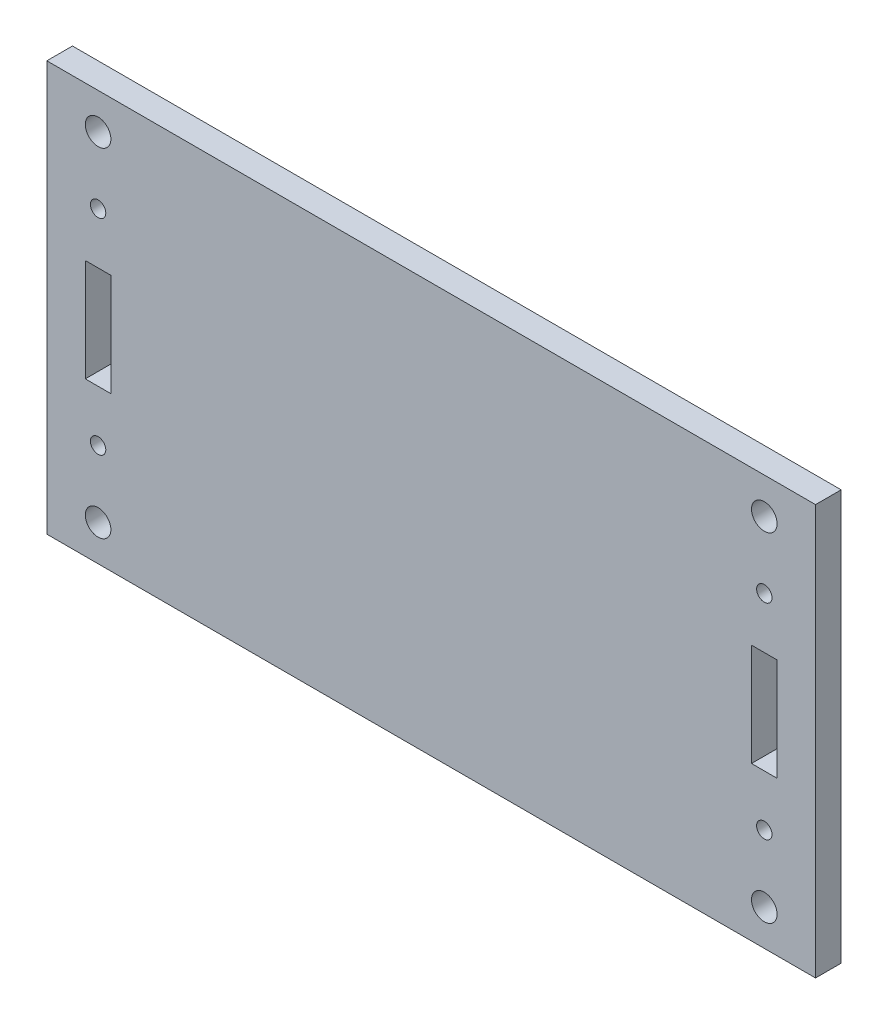
ISO-10303-21;
HEADER;
FILE_DESCRIPTION(('STEP AP214'),'2;1');
FILE_NAME('part.step','',(''),(''),'','','');
FILE_SCHEMA(('AUTOMOTIVE_DESIGN { 1 0 10303 214 1 1 1 1 }'));
ENDSEC;
DATA;
#1=APPLICATION_CONTEXT('core data for automotive mechanical design processes');
#2=APPLICATION_PROTOCOL_DEFINITION('international standard','automotive_design',2000,#1);
#3=PRODUCT_CONTEXT('',#1,'mechanical');
#4=PRODUCT('Part','Part','',(#3));
#5=PRODUCT_RELATED_PRODUCT_CATEGORY('part','',(#4));
#6=PRODUCT_DEFINITION_FORMATION('','',#4);
#7=PRODUCT_DEFINITION_CONTEXT('part definition',#1,'design');
#8=PRODUCT_DEFINITION('design','',#6,#7);
#9=PRODUCT_DEFINITION_SHAPE('','',#8);
#10=(LENGTH_UNIT() NAMED_UNIT(*) SI_UNIT(.MILLI.,.METRE.));
#11=(NAMED_UNIT(*) PLANE_ANGLE_UNIT() SI_UNIT($,.RADIAN.));
#12=(NAMED_UNIT(*) SI_UNIT($,.STERADIAN.) SOLID_ANGLE_UNIT());
#13=UNCERTAINTY_MEASURE_WITH_UNIT(LENGTH_MEASURE(1.E-05),#10,'distance_accuracy_value','');
#14=(GEOMETRIC_REPRESENTATION_CONTEXT(3) GLOBAL_UNCERTAINTY_ASSIGNED_CONTEXT((#13)) GLOBAL_UNIT_ASSIGNED_CONTEXT((#10,
#11,#12)) REPRESENTATION_CONTEXT('',''));
#15=CARTESIAN_POINT('',(0.,0.,0.));
#16=DIRECTION('',(0.,0.,1.));
#17=DIRECTION('',(1.,0.,0.));
#18=AXIS2_PLACEMENT_3D('',#15,#16,#17);
#19=CARTESIAN_POINT('',(0.,0.,5.));
#20=DIRECTION('',(0.,0.,1.));
#21=DIRECTION('',(1.,0.,0.));
#22=AXIS2_PLACEMENT_3D('',#19,#20,#21);
#23=PLANE('',#22);
#24=DIRECTION('',(-1.,0.,0.));
#25=VECTOR('',#24,1.);
#26=CARTESIAN_POINT('',(67.5,20.,5.));
#27=LINE('',#26,#25);
#28=CARTESIAN_POINT('',(67.5,20.,5.));
#29=VERTEX_POINT('',#28);
#30=CARTESIAN_POINT('',(62.5,20.,5.));
#31=VERTEX_POINT('',#30);
#32=EDGE_CURVE('E136',#29,#31,#27,.T.);
#33=ORIENTED_EDGE('',*,*,#32,.F.);
#34=DIRECTION('',(0.,1.,0.));
#35=VECTOR('',#34,1.);
#36=CARTESIAN_POINT('',(67.5,20.,5.));
#37=LINE('',#36,#35);
#38=CARTESIAN_POINT('',(67.5,0.,5.));
#39=VERTEX_POINT('',#38);
#40=EDGE_CURVE('E128',#39,#29,#37,.T.);
#41=ORIENTED_EDGE('',*,*,#40,.F.);
#42=DIRECTION('',(1.,0.,0.));
#43=VECTOR('',#42,1.);
#44=CARTESIAN_POINT('',(67.5,0.,5.));
#45=LINE('',#44,#43);
#46=CARTESIAN_POINT('',(62.5,0.,5.));
#47=VERTEX_POINT('',#46);
#48=EDGE_CURVE('E151',#47,#39,#45,.T.);
#49=ORIENTED_EDGE('',*,*,#48,.F.);
#50=DIRECTION('',(0.,-1.,0.));
#51=VECTOR('',#50,1.);
#52=CARTESIAN_POINT('',(62.5,20.,5.));
#53=LINE('',#52,#51);
#54=EDGE_CURVE('E149',#31,#47,#53,.T.);
#55=ORIENTED_EDGE('',*,*,#54,.F.);
#56=EDGE_LOOP('',(#33,#41,#49,#55));
#57=FACE_BOUND('',#56,.T.);
#58=CARTESIAN_POINT('',(65.,30.,5.));
#59=DIRECTION('',(0.,0.,1.));
#60=DIRECTION('',(-1.,0.,0.));
#61=AXIS2_PLACEMENT_3D('',#58,#59,#60);
#62=CIRCLE('',#61,1.5);
#63=CARTESIAN_POINT('',(63.5,30.,5.));
#64=VERTEX_POINT('',#63);
#65=EDGE_CURVE('E167',#64,#64,#62,.T.);
#66=ORIENTED_EDGE('',*,*,#65,.F.);
#67=EDGE_LOOP('',(#66));
#68=FACE_BOUND('',#67,.T.);
#69=CARTESIAN_POINT('',(-65.,-9.99999999999999,5.));
#70=DIRECTION('',(0.,0.,1.));
#71=DIRECTION('',(-1.,0.,0.));
#72=AXIS2_PLACEMENT_3D('',#69,#70,#71);
#73=CIRCLE('',#72,1.5);
#74=CARTESIAN_POINT('',(-66.5,-9.99999999999999,5.));
#75=VERTEX_POINT('',#74);
#76=EDGE_CURVE('E179',#75,#75,#73,.T.);
#77=ORIENTED_EDGE('',*,*,#76,.F.);
#78=EDGE_LOOP('',(#77));
#79=FACE_BOUND('',#78,.T.);
#80=CARTESIAN_POINT('',(65.,-23.,5.));
#81=DIRECTION('',(0.,0.,1.));
#82=DIRECTION('',(1.,0.,0.));
#83=AXIS2_PLACEMENT_3D('',#80,#81,#82);
#84=CIRCLE('',#83,2.5);
#85=CARTESIAN_POINT('',(67.5,-23.,5.));
#86=VERTEX_POINT('',#85);
#87=EDGE_CURVE('E222',#86,#86,#84,.T.);
#88=ORIENTED_EDGE('',*,*,#87,.F.);
#89=EDGE_LOOP('',(#88));
#90=FACE_BOUND('',#89,.T.);
#91=CARTESIAN_POINT('',(-65.,43.,5.));
#92=DIRECTION('',(0.,0.,1.));
#93=DIRECTION('',(1.,0.,0.));
#94=AXIS2_PLACEMENT_3D('',#91,#92,#93);
#95=CIRCLE('',#94,2.50000000000001);
#96=CARTESIAN_POINT('',(-62.5,43.,5.));
#97=VERTEX_POINT('',#96);
#98=EDGE_CURVE('E234',#97,#97,#95,.T.);
#99=ORIENTED_EDGE('',*,*,#98,.F.);
#100=EDGE_LOOP('',(#99));
#101=FACE_BOUND('',#100,.T.);
#102=DIRECTION('',(0.,1.,0.));
#103=VECTOR('',#102,1.);
#104=CARTESIAN_POINT('',(75.,50.,5.));
#105=LINE('',#104,#103);
#106=CARTESIAN_POINT('',(75.,-30.,5.));
#107=VERTEX_POINT('',#106);
#108=CARTESIAN_POINT('',(75.,50.,5.));
#109=VERTEX_POINT('',#108);
#110=EDGE_CURVE('E240',#107,#109,#105,.T.);
#111=ORIENTED_EDGE('',*,*,#110,.T.);
#112=DIRECTION('',(-1.,0.,0.));
#113=VECTOR('',#112,1.);
#114=CARTESIAN_POINT('',(-75.,50.,5.));
#115=LINE('',#114,#113);
#116=CARTESIAN_POINT('',(-75.,50.,5.));
#117=VERTEX_POINT('',#116);
#118=EDGE_CURVE('E243',#109,#117,#115,.T.);
#119=ORIENTED_EDGE('',*,*,#118,.T.);
#120=DIRECTION('',(0.,-1.,0.));
#121=VECTOR('',#120,1.);
#122=CARTESIAN_POINT('',(-75.,50.,5.));
#123=LINE('',#122,#121);
#124=CARTESIAN_POINT('',(-75.,-30.,5.));
#125=VERTEX_POINT('',#124);
#126=EDGE_CURVE('E246',#117,#125,#123,.T.);
#127=ORIENTED_EDGE('',*,*,#126,.T.);
#128=DIRECTION('',(1.,0.,0.));
#129=VECTOR('',#128,1.);
#130=CARTESIAN_POINT('',(-75.,-30.,5.));
#131=LINE('',#130,#129);
#132=EDGE_CURVE('E248',#125,#107,#131,.T.);
#133=ORIENTED_EDGE('',*,*,#132,.T.);
#134=EDGE_LOOP('',(#111,#119,#127,#133));
#135=FACE_BOUND('',#134,.T.);
#136=CARTESIAN_POINT('',(65.,43.,5.));
#137=DIRECTION('',(0.,0.,1.));
#138=DIRECTION('',(-1.,0.,0.));
#139=AXIS2_PLACEMENT_3D('',#136,#137,#138);
#140=CIRCLE('',#139,2.50000000000001);
#141=CARTESIAN_POINT('',(62.5,43.,5.));
#142=VERTEX_POINT('',#141);
#143=EDGE_CURVE('E228',#142,#142,#140,.T.);
#144=ORIENTED_EDGE('',*,*,#143,.F.);
#145=EDGE_LOOP('',(#144));
#146=FACE_BOUND('',#145,.T.);
#147=CARTESIAN_POINT('',(-65.,-23.,5.));
#148=DIRECTION('',(0.,0.,1.));
#149=DIRECTION('',(-1.,0.,0.));
#150=AXIS2_PLACEMENT_3D('',#147,#148,#149);
#151=CIRCLE('',#150,2.5);
#152=CARTESIAN_POINT('',(-67.5,-23.,5.));
#153=VERTEX_POINT('',#152);
#154=EDGE_CURVE('E216',#153,#153,#151,.T.);
#155=ORIENTED_EDGE('',*,*,#154,.F.);
#156=EDGE_LOOP('',(#155));
#157=FACE_BOUND('',#156,.T.);
#158=DIRECTION('',(1.,0.,0.));
#159=VECTOR('',#158,1.);
#160=CARTESIAN_POINT('',(-67.5,0.,5.));
#161=LINE('',#160,#159);
#162=CARTESIAN_POINT('',(-67.5,0.,5.));
#163=VERTEX_POINT('',#162);
#164=CARTESIAN_POINT('',(-62.5,0.,5.));
#165=VERTEX_POINT('',#164);
#166=EDGE_CURVE('E187',#163,#165,#161,.T.);
#167=ORIENTED_EDGE('',*,*,#166,.F.);
#168=DIRECTION('',(0.,-1.,0.));
#169=VECTOR('',#168,1.);
#170=CARTESIAN_POINT('',(-67.5,20.,5.));
#171=LINE('',#170,#169);
#172=CARTESIAN_POINT('',(-67.5,20.,5.));
#173=VERTEX_POINT('',#172);
#174=EDGE_CURVE('E185',#173,#163,#171,.T.);
#175=ORIENTED_EDGE('',*,*,#174,.F.);
#176=DIRECTION('',(-1.,0.,0.));
#177=VECTOR('',#176,1.);
#178=CARTESIAN_POINT('',(-67.5,20.,5.));
#179=LINE('',#178,#177);
#180=CARTESIAN_POINT('',(-62.5,20.,5.));
#181=VERTEX_POINT('',#180);
#182=EDGE_CURVE('E193',#181,#173,#179,.T.);
#183=ORIENTED_EDGE('',*,*,#182,.F.);
#184=DIRECTION('',(0.,1.,0.));
#185=VECTOR('',#184,1.);
#186=CARTESIAN_POINT('',(-62.5,20.,5.));
#187=LINE('',#186,#185);
#188=EDGE_CURVE('E190',#165,#181,#187,.T.);
#189=ORIENTED_EDGE('',*,*,#188,.F.);
#190=EDGE_LOOP('',(#167,#175,#183,#189));
#191=FACE_BOUND('',#190,.T.);
#192=CARTESIAN_POINT('',(65.,-10.,5.));
#193=DIRECTION('',(0.,0.,1.));
#194=DIRECTION('',(1.,0.,0.));
#195=AXIS2_PLACEMENT_3D('',#192,#193,#194);
#196=CIRCLE('',#195,1.5);
#197=CARTESIAN_POINT('',(66.5,-10.,5.));
#198=VERTEX_POINT('',#197);
#199=EDGE_CURVE('E173',#198,#198,#196,.T.);
#200=ORIENTED_EDGE('',*,*,#199,.F.);
#201=EDGE_LOOP('',(#200));
#202=FACE_BOUND('',#201,.T.);
#203=CARTESIAN_POINT('',(-65.,30.,5.));
#204=DIRECTION('',(0.,0.,1.));
#205=DIRECTION('',(1.,0.,0.));
#206=AXIS2_PLACEMENT_3D('',#203,#204,#205);
#207=CIRCLE('',#206,1.5);
#208=CARTESIAN_POINT('',(-63.5,30.,5.));
#209=VERTEX_POINT('',#208);
#210=EDGE_CURVE('E157',#209,#209,#207,.T.);
#211=ORIENTED_EDGE('',*,*,#210,.F.);
#212=EDGE_LOOP('',(#211));
#213=FACE_BOUND('',#212,.T.);
#214=ADVANCED_FACE('F39',(#57,#68,#79,#90,#101,#135,#146,#157,#191,#202,#213),#23,.T.);
#215=CARTESIAN_POINT('',(0.,0.,0.));
#216=DIRECTION('',(0.,0.,1.));
#217=DIRECTION('',(1.,0.,0.));
#218=AXIS2_PLACEMENT_3D('',#215,#216,#217);
#219=PLANE('',#218);
#220=CARTESIAN_POINT('',(65.,30.,0.));
#221=DIRECTION('',(0.,0.,1.));
#222=DIRECTION('',(-1.,0.,0.));
#223=AXIS2_PLACEMENT_3D('',#220,#221,#222);
#224=CIRCLE('',#223,1.5);
#225=CARTESIAN_POINT('',(63.5,30.,0.));
#226=VERTEX_POINT('',#225);
#227=EDGE_CURVE('E144',#226,#226,#224,.T.);
#228=ORIENTED_EDGE('',*,*,#227,.T.);
#229=EDGE_LOOP('',(#228));
#230=FACE_BOUND('',#229,.T.);
#231=CARTESIAN_POINT('',(65.,-10.,0.));
#232=DIRECTION('',(0.,0.,1.));
#233=DIRECTION('',(1.,0.,0.));
#234=AXIS2_PLACEMENT_3D('',#231,#232,#233);
#235=CIRCLE('',#234,1.5);
#236=CARTESIAN_POINT('',(66.5,-10.,0.));
#237=VERTEX_POINT('',#236);
#238=EDGE_CURVE('E170',#237,#237,#235,.T.);
#239=ORIENTED_EDGE('',*,*,#238,.T.);
#240=EDGE_LOOP('',(#239));
#241=FACE_BOUND('',#240,.T.);
#242=CARTESIAN_POINT('',(-65.,-9.99999999999999,0.));
#243=DIRECTION('',(0.,0.,1.));
#244=DIRECTION('',(-1.,0.,0.));
#245=AXIS2_PLACEMENT_3D('',#242,#243,#244);
#246=CIRCLE('',#245,1.5);
#247=CARTESIAN_POINT('',(-66.5,-9.99999999999999,0.));
#248=VERTEX_POINT('',#247);
#249=EDGE_CURVE('E176',#248,#248,#246,.T.);
#250=ORIENTED_EDGE('',*,*,#249,.T.);
#251=EDGE_LOOP('',(#250));
#252=FACE_BOUND('',#251,.T.);
#253=DIRECTION('',(0.,-1.,0.));
#254=VECTOR('',#253,1.);
#255=CARTESIAN_POINT('',(-67.5,20.,0.));
#256=LINE('',#255,#254);
#257=CARTESIAN_POINT('',(-67.5,20.,0.));
#258=VERTEX_POINT('',#257);
#259=CARTESIAN_POINT('',(-67.5,0.,0.));
#260=VERTEX_POINT('',#259);
#261=EDGE_CURVE('E182',#258,#260,#256,.T.);
#262=ORIENTED_EDGE('',*,*,#261,.T.);
#263=DIRECTION('',(1.,0.,0.));
#264=VECTOR('',#263,1.);
#265=CARTESIAN_POINT('',(-67.5,0.,0.));
#266=LINE('',#265,#264);
#267=CARTESIAN_POINT('',(-62.5,0.,0.));
#268=VERTEX_POINT('',#267);
#269=EDGE_CURVE('E198',#260,#268,#266,.T.);
#270=ORIENTED_EDGE('',*,*,#269,.T.);
#271=DIRECTION('',(0.,1.,0.));
#272=VECTOR('',#271,1.);
#273=CARTESIAN_POINT('',(-62.5,20.,0.));
#274=LINE('',#273,#272);
#275=CARTESIAN_POINT('',(-62.5,20.,0.));
#276=VERTEX_POINT('',#275);
#277=EDGE_CURVE('E201',#268,#276,#274,.T.);
#278=ORIENTED_EDGE('',*,*,#277,.T.);
#279=DIRECTION('',(-1.,0.,0.));
#280=VECTOR('',#279,1.);
#281=CARTESIAN_POINT('',(-67.5,20.,0.));
#282=LINE('',#281,#280);
#283=EDGE_CURVE('E188',#276,#258,#282,.T.);
#284=ORIENTED_EDGE('',*,*,#283,.T.);
#285=EDGE_LOOP('',(#262,#270,#278,#284));
#286=FACE_BOUND('',#285,.T.);
#287=DIRECTION('',(0.,1.,0.));
#288=VECTOR('',#287,1.);
#289=CARTESIAN_POINT('',(75.,50.,0.));
#290=LINE('',#289,#288);
#291=CARTESIAN_POINT('',(75.,-30.,0.));
#292=VERTEX_POINT('',#291);
#293=CARTESIAN_POINT('',(75.,50.,0.));
#294=VERTEX_POINT('',#293);
#295=EDGE_CURVE('E237',#292,#294,#290,.T.);
#296=ORIENTED_EDGE('',*,*,#295,.F.);
#297=DIRECTION('',(1.,0.,0.));
#298=VECTOR('',#297,1.);
#299=CARTESIAN_POINT('',(-75.,-30.,0.));
#300=LINE('',#299,#298);
#301=CARTESIAN_POINT('',(-75.,-30.,0.));
#302=VERTEX_POINT('',#301);
#303=EDGE_CURVE('E244',#302,#292,#300,.T.);
#304=ORIENTED_EDGE('',*,*,#303,.F.);
#305=DIRECTION('',(0.,-1.,0.));
#306=VECTOR('',#305,1.);
#307=CARTESIAN_POINT('',(-75.,50.,0.));
#308=LINE('',#307,#306);
#309=CARTESIAN_POINT('',(-75.,50.,0.));
#310=VERTEX_POINT('',#309);
#311=EDGE_CURVE('E255',#310,#302,#308,.T.);
#312=ORIENTED_EDGE('',*,*,#311,.F.);
#313=DIRECTION('',(-1.,0.,0.));
#314=VECTOR('',#313,1.);
#315=CARTESIAN_POINT('',(-75.,50.,0.));
#316=LINE('',#315,#314);
#317=EDGE_CURVE('E253',#294,#310,#316,.T.);
#318=ORIENTED_EDGE('',*,*,#317,.F.);
#319=EDGE_LOOP('',(#296,#304,#312,#318));
#320=FACE_BOUND('',#319,.T.);
#321=CARTESIAN_POINT('',(-65.,43.,0.));
#322=DIRECTION('',(0.,0.,1.));
#323=DIRECTION('',(1.,0.,0.));
#324=AXIS2_PLACEMENT_3D('',#321,#322,#323);
#325=CIRCLE('',#324,2.50000000000001);
#326=CARTESIAN_POINT('',(-62.5,43.,0.));
#327=VERTEX_POINT('',#326);
#328=EDGE_CURVE('E231',#327,#327,#325,.T.);
#329=ORIENTED_EDGE('',*,*,#328,.T.);
#330=EDGE_LOOP('',(#329));
#331=FACE_BOUND('',#330,.T.);
#332=CARTESIAN_POINT('',(65.,43.,0.));
#333=DIRECTION('',(0.,0.,1.));
#334=DIRECTION('',(-1.,0.,0.));
#335=AXIS2_PLACEMENT_3D('',#332,#333,#334);
#336=CIRCLE('',#335,2.50000000000001);
#337=CARTESIAN_POINT('',(62.5,43.,0.));
#338=VERTEX_POINT('',#337);
#339=EDGE_CURVE('E225',#338,#338,#336,.T.);
#340=ORIENTED_EDGE('',*,*,#339,.T.);
#341=EDGE_LOOP('',(#340));
#342=FACE_BOUND('',#341,.T.);
#343=CARTESIAN_POINT('',(65.,-23.,0.));
#344=DIRECTION('',(0.,0.,1.));
#345=DIRECTION('',(1.,0.,0.));
#346=AXIS2_PLACEMENT_3D('',#343,#344,#345);
#347=CIRCLE('',#346,2.5);
#348=CARTESIAN_POINT('',(67.5,-23.,0.));
#349=VERTEX_POINT('',#348);
#350=EDGE_CURVE('E219',#349,#349,#347,.T.);
#351=ORIENTED_EDGE('',*,*,#350,.T.);
#352=EDGE_LOOP('',(#351));
#353=FACE_BOUND('',#352,.T.);
#354=CARTESIAN_POINT('',(-65.,-23.,0.));
#355=DIRECTION('',(0.,0.,1.));
#356=DIRECTION('',(-1.,0.,0.));
#357=AXIS2_PLACEMENT_3D('',#354,#355,#356);
#358=CIRCLE('',#357,2.5);
#359=CARTESIAN_POINT('',(-67.5,-23.,0.));
#360=VERTEX_POINT('',#359);
#361=EDGE_CURVE('E215',#360,#360,#358,.T.);
#362=ORIENTED_EDGE('',*,*,#361,.T.);
#363=EDGE_LOOP('',(#362));
#364=FACE_BOUND('',#363,.T.);
#365=DIRECTION('',(0.,1.,0.));
#366=VECTOR('',#365,1.);
#367=CARTESIAN_POINT('',(67.5,20.,0.));
#368=LINE('',#367,#366);
#369=CARTESIAN_POINT('',(67.5,0.,0.));
#370=VERTEX_POINT('',#369);
#371=CARTESIAN_POINT('',(67.5,20.,0.));
#372=VERTEX_POINT('',#371);
#373=EDGE_CURVE('E62',#370,#372,#368,.T.);
#374=ORIENTED_EDGE('',*,*,#373,.T.);
#375=DIRECTION('',(-1.,0.,0.));
#376=VECTOR('',#375,1.);
#377=CARTESIAN_POINT('',(67.5,20.,0.));
#378=LINE('',#377,#376);
#379=CARTESIAN_POINT('',(62.5,20.,0.));
#380=VERTEX_POINT('',#379);
#381=EDGE_CURVE('E143',#372,#380,#378,.T.);
#382=ORIENTED_EDGE('',*,*,#381,.T.);
#383=DIRECTION('',(0.,-1.,0.));
#384=VECTOR('',#383,1.);
#385=CARTESIAN_POINT('',(62.5,20.,0.));
#386=LINE('',#385,#384);
#387=CARTESIAN_POINT('',(62.5,0.,0.));
#388=VERTEX_POINT('',#387);
#389=EDGE_CURVE('E159',#380,#388,#386,.T.);
#390=ORIENTED_EDGE('',*,*,#389,.T.);
#391=DIRECTION('',(1.,0.,0.));
#392=VECTOR('',#391,1.);
#393=CARTESIAN_POINT('',(67.5,0.,0.));
#394=LINE('',#393,#392);
#395=EDGE_CURVE('E137',#388,#370,#394,.T.);
#396=ORIENTED_EDGE('',*,*,#395,.T.);
#397=EDGE_LOOP('',(#374,#382,#390,#396));
#398=FACE_BOUND('',#397,.T.);
#399=CARTESIAN_POINT('',(-65.,30.,0.));
#400=DIRECTION('',(0.,0.,1.));
#401=DIRECTION('',(1.,0.,0.));
#402=AXIS2_PLACEMENT_3D('',#399,#400,#401);
#403=CIRCLE('',#402,1.5);
#404=CARTESIAN_POINT('',(-63.5,30.,0.));
#405=VERTEX_POINT('',#404);
#406=EDGE_CURVE('E326',#405,#405,#403,.T.);
#407=ORIENTED_EDGE('',*,*,#406,.T.);
#408=EDGE_LOOP('',(#407));
#409=FACE_BOUND('',#408,.T.);
#410=ADVANCED_FACE('F273',(#230,#241,#252,#286,#320,#331,#342,#353,#364,#398,#409),#219,.F.);
#411=CARTESIAN_POINT('',(75.,50.,5.));
#412=DIRECTION('',(-1.,0.,0.));
#413=DIRECTION('',(0.,0.,1.));
#414=AXIS2_PLACEMENT_3D('',#411,#412,#413);
#415=PLANE('',#414);
#416=ORIENTED_EDGE('',*,*,#295,.T.);
#417=DIRECTION('',(0.,0.,-1.));
#418=VECTOR('',#417,1.);
#419=CARTESIAN_POINT('',(75.,50.,5.));
#420=LINE('',#419,#418);
#421=EDGE_CURVE('E11',#109,#294,#420,.T.);
#422=ORIENTED_EDGE('',*,*,#421,.F.);
#423=ORIENTED_EDGE('',*,*,#110,.F.);
#424=DIRECTION('',(0.,0.,-1.));
#425=VECTOR('',#424,1.);
#426=CARTESIAN_POINT('',(75.,-30.,5.));
#427=LINE('',#426,#425);
#428=EDGE_CURVE('E250',#107,#292,#427,.T.);
#429=ORIENTED_EDGE('',*,*,#428,.T.);
#430=EDGE_LOOP('',(#416,#422,#423,#429));
#431=FACE_BOUND('',#430,.T.);
#432=ADVANCED_FACE('F41',(#431),#415,.F.);
#433=CARTESIAN_POINT('',(-75.,50.,5.));
#434=DIRECTION('',(0.,-1.,0.));
#435=DIRECTION('',(0.,0.,-1.));
#436=AXIS2_PLACEMENT_3D('',#433,#434,#435);
#437=PLANE('',#436);
#438=ORIENTED_EDGE('',*,*,#317,.T.);
#439=DIRECTION('',(0.,0.,-1.));
#440=VECTOR('',#439,1.);
#441=CARTESIAN_POINT('',(-75.,50.,5.));
#442=LINE('',#441,#440);
#443=EDGE_CURVE('E47',#117,#310,#442,.T.);
#444=ORIENTED_EDGE('',*,*,#443,.F.);
#445=ORIENTED_EDGE('',*,*,#118,.F.);
#446=ORIENTED_EDGE('',*,*,#421,.T.);
#447=EDGE_LOOP('',(#438,#444,#445,#446));
#448=FACE_BOUND('',#447,.T.);
#449=ADVANCED_FACE('F284',(#448),#437,.F.);
#450=CARTESIAN_POINT('',(-75.,50.,5.));
#451=DIRECTION('',(1.,0.,0.));
#452=DIRECTION('',(0.,0.,-1.));
#453=AXIS2_PLACEMENT_3D('',#450,#451,#452);
#454=PLANE('',#453);
#455=ORIENTED_EDGE('',*,*,#311,.T.);
#456=DIRECTION('',(0.,0.,-1.));
#457=VECTOR('',#456,1.);
#458=CARTESIAN_POINT('',(-75.,-30.,5.));
#459=LINE('',#458,#457);
#460=EDGE_CURVE('E260',#125,#302,#459,.T.);
#461=ORIENTED_EDGE('',*,*,#460,.F.);
#462=ORIENTED_EDGE('',*,*,#126,.F.);
#463=ORIENTED_EDGE('',*,*,#443,.T.);
#464=EDGE_LOOP('',(#455,#461,#462,#463));
#465=FACE_BOUND('',#464,.T.);
#466=ADVANCED_FACE('F267',(#465),#454,.F.);
#467=CARTESIAN_POINT('',(-75.,-30.,5.));
#468=DIRECTION('',(0.,1.,0.));
#469=DIRECTION('',(0.,0.,1.));
#470=AXIS2_PLACEMENT_3D('',#467,#468,#469);
#471=PLANE('',#470);
#472=ORIENTED_EDGE('',*,*,#303,.T.);
#473=ORIENTED_EDGE('',*,*,#428,.F.);
#474=ORIENTED_EDGE('',*,*,#132,.F.);
#475=ORIENTED_EDGE('',*,*,#460,.T.);
#476=EDGE_LOOP('',(#472,#473,#474,#475));
#477=FACE_BOUND('',#476,.T.);
#478=ADVANCED_FACE('F277',(#477),#471,.F.);
#479=CARTESIAN_POINT('',(-65.,43.,5.));
#480=DIRECTION('',(0.,0.,-1.));
#481=DIRECTION('',(-1.,0.,0.));
#482=AXIS2_PLACEMENT_3D('',#479,#480,#481);
#483=CYLINDRICAL_SURFACE('',#482,2.50000000000001);
#484=ORIENTED_EDGE('',*,*,#98,.T.);
#485=EDGE_LOOP('',(#484));
#486=FACE_BOUND('',#485,.T.);
#487=ORIENTED_EDGE('',*,*,#328,.F.);
#488=EDGE_LOOP('',(#487));
#489=FACE_BOUND('',#488,.T.);
#490=ADVANCED_FACE('F299',(#486,#489),#483,.F.);
#491=CARTESIAN_POINT('',(65.,43.,5.));
#492=DIRECTION('',(0.,0.,-1.));
#493=DIRECTION('',(-1.,0.,0.));
#494=AXIS2_PLACEMENT_3D('',#491,#492,#493);
#495=CYLINDRICAL_SURFACE('',#494,2.50000000000001);
#496=ORIENTED_EDGE('',*,*,#143,.T.);
#497=EDGE_LOOP('',(#496));
#498=FACE_BOUND('',#497,.T.);
#499=ORIENTED_EDGE('',*,*,#339,.F.);
#500=EDGE_LOOP('',(#499));
#501=FACE_BOUND('',#500,.T.);
#502=ADVANCED_FACE('F306',(#498,#501),#495,.F.);
#503=CARTESIAN_POINT('',(65.,-23.,5.));
#504=DIRECTION('',(0.,0.,-1.));
#505=DIRECTION('',(-1.,0.,0.));
#506=AXIS2_PLACEMENT_3D('',#503,#504,#505);
#507=CYLINDRICAL_SURFACE('',#506,2.5);
#508=ORIENTED_EDGE('',*,*,#87,.T.);
#509=EDGE_LOOP('',(#508));
#510=FACE_BOUND('',#509,.T.);
#511=ORIENTED_EDGE('',*,*,#350,.F.);
#512=EDGE_LOOP('',(#511));
#513=FACE_BOUND('',#512,.T.);
#514=ADVANCED_FACE('F311',(#510,#513),#507,.F.);
#515=CARTESIAN_POINT('',(-65.,-23.,5.));
#516=DIRECTION('',(0.,0.,-1.));
#517=DIRECTION('',(-1.,0.,0.));
#518=AXIS2_PLACEMENT_3D('',#515,#516,#517);
#519=CYLINDRICAL_SURFACE('',#518,2.5);
#520=ORIENTED_EDGE('',*,*,#154,.T.);
#521=EDGE_LOOP('',(#520));
#522=FACE_BOUND('',#521,.T.);
#523=ORIENTED_EDGE('',*,*,#361,.F.);
#524=EDGE_LOOP('',(#523));
#525=FACE_BOUND('',#524,.T.);
#526=ADVANCED_FACE('F377',(#522,#525),#519,.F.);
#527=CARTESIAN_POINT('',(-67.5,20.,5.));
#528=DIRECTION('',(1.,0.,0.));
#529=DIRECTION('',(0.,0.,-1.));
#530=AXIS2_PLACEMENT_3D('',#527,#528,#529);
#531=PLANE('',#530);
#532=ORIENTED_EDGE('',*,*,#261,.F.);
#533=DIRECTION('',(0.,0.,-1.));
#534=VECTOR('',#533,1.);
#535=CARTESIAN_POINT('',(-67.5,20.,5.));
#536=LINE('',#535,#534);
#537=EDGE_CURVE('E195',#173,#258,#536,.T.);
#538=ORIENTED_EDGE('',*,*,#537,.F.);
#539=ORIENTED_EDGE('',*,*,#174,.T.);
#540=DIRECTION('',(0.,0.,-1.));
#541=VECTOR('',#540,1.);
#542=CARTESIAN_POINT('',(-67.5,0.,5.));
#543=LINE('',#542,#541);
#544=EDGE_CURVE('E212',#163,#260,#543,.T.);
#545=ORIENTED_EDGE('',*,*,#544,.T.);
#546=EDGE_LOOP('',(#532,#538,#539,#545));
#547=FACE_BOUND('',#546,.T.);
#548=ADVANCED_FACE('F373',(#547),#531,.T.);
#549=CARTESIAN_POINT('',(-67.5,0.,5.));
#550=DIRECTION('',(0.,1.,0.));
#551=DIRECTION('',(0.,0.,1.));
#552=AXIS2_PLACEMENT_3D('',#549,#550,#551);
#553=PLANE('',#552);
#554=ORIENTED_EDGE('',*,*,#269,.F.);
#555=ORIENTED_EDGE('',*,*,#544,.F.);
#556=ORIENTED_EDGE('',*,*,#166,.T.);
#557=DIRECTION('',(0.,0.,-1.));
#558=VECTOR('',#557,1.);
#559=CARTESIAN_POINT('',(-62.5,0.,5.));
#560=LINE('',#559,#558);
#561=EDGE_CURVE('E210',#165,#268,#560,.T.);
#562=ORIENTED_EDGE('',*,*,#561,.T.);
#563=EDGE_LOOP('',(#554,#555,#556,#562));
#564=FACE_BOUND('',#563,.T.);
#565=ADVANCED_FACE('F369',(#564),#553,.T.);
#566=CARTESIAN_POINT('',(-62.5,20.,5.));
#567=DIRECTION('',(-1.,0.,0.));
#568=DIRECTION('',(0.,0.,1.));
#569=AXIS2_PLACEMENT_3D('',#566,#567,#568);
#570=PLANE('',#569);
#571=ORIENTED_EDGE('',*,*,#277,.F.);
#572=ORIENTED_EDGE('',*,*,#561,.F.);
#573=ORIENTED_EDGE('',*,*,#188,.T.);
#574=DIRECTION('',(0.,0.,-1.));
#575=VECTOR('',#574,1.);
#576=CARTESIAN_POINT('',(-62.5,20.,5.));
#577=LINE('',#576,#575);
#578=EDGE_CURVE('E208',#181,#276,#577,.T.);
#579=ORIENTED_EDGE('',*,*,#578,.T.);
#580=EDGE_LOOP('',(#571,#572,#573,#579));
#581=FACE_BOUND('',#580,.T.);
#582=ADVANCED_FACE('F365',(#581),#570,.T.);
#583=CARTESIAN_POINT('',(-67.5,20.,5.));
#584=DIRECTION('',(0.,-1.,0.));
#585=DIRECTION('',(0.,0.,-1.));
#586=AXIS2_PLACEMENT_3D('',#583,#584,#585);
#587=PLANE('',#586);
#588=ORIENTED_EDGE('',*,*,#283,.F.);
#589=ORIENTED_EDGE('',*,*,#578,.F.);
#590=ORIENTED_EDGE('',*,*,#182,.T.);
#591=ORIENTED_EDGE('',*,*,#537,.T.);
#592=EDGE_LOOP('',(#588,#589,#590,#591));
#593=FACE_BOUND('',#592,.T.);
#594=ADVANCED_FACE('F361',(#593),#587,.T.);
#595=CARTESIAN_POINT('',(-65.,-9.99999999999999,5.));
#596=DIRECTION('',(0.,0.,-1.));
#597=DIRECTION('',(-1.,0.,0.));
#598=AXIS2_PLACEMENT_3D('',#595,#596,#597);
#599=CYLINDRICAL_SURFACE('',#598,1.5);
#600=ORIENTED_EDGE('',*,*,#76,.T.);
#601=EDGE_LOOP('',(#600));
#602=FACE_BOUND('',#601,.T.);
#603=ORIENTED_EDGE('',*,*,#249,.F.);
#604=EDGE_LOOP('',(#603));
#605=FACE_BOUND('',#604,.T.);
#606=ADVANCED_FACE('F357',(#602,#605),#599,.F.);
#607=CARTESIAN_POINT('',(65.,-10.,5.));
#608=DIRECTION('',(0.,0.,-1.));
#609=DIRECTION('',(-1.,0.,0.));
#610=AXIS2_PLACEMENT_3D('',#607,#608,#609);
#611=CYLINDRICAL_SURFACE('',#610,1.5);
#612=ORIENTED_EDGE('',*,*,#199,.T.);
#613=EDGE_LOOP('',(#612));
#614=FACE_BOUND('',#613,.T.);
#615=ORIENTED_EDGE('',*,*,#238,.F.);
#616=EDGE_LOOP('',(#615));
#617=FACE_BOUND('',#616,.T.);
#618=ADVANCED_FACE('F353',(#614,#617),#611,.F.);
#619=CARTESIAN_POINT('',(65.,30.,5.));
#620=DIRECTION('',(0.,0.,-1.));
#621=DIRECTION('',(-1.,0.,0.));
#622=AXIS2_PLACEMENT_3D('',#619,#620,#621);
#623=CYLINDRICAL_SURFACE('',#622,1.5);
#624=ORIENTED_EDGE('',*,*,#65,.T.);
#625=EDGE_LOOP('',(#624));
#626=FACE_BOUND('',#625,.T.);
#627=ORIENTED_EDGE('',*,*,#227,.F.);
#628=EDGE_LOOP('',(#627));
#629=FACE_BOUND('',#628,.T.);
#630=ADVANCED_FACE('F350',(#626,#629),#623,.F.);
#631=CARTESIAN_POINT('',(67.5,20.,5.));
#632=DIRECTION('',(-1.,0.,0.));
#633=DIRECTION('',(0.,-1.,0.));
#634=AXIS2_PLACEMENT_3D('',#631,#632,#633);
#635=PLANE('',#634);
#636=ORIENTED_EDGE('',*,*,#373,.F.);
#637=DIRECTION('',(0.,0.,-1.));
#638=VECTOR('',#637,1.);
#639=CARTESIAN_POINT('',(67.5,0.,5.));
#640=LINE('',#639,#638);
#641=EDGE_CURVE('E132',#39,#370,#640,.T.);
#642=ORIENTED_EDGE('',*,*,#641,.F.);
#643=ORIENTED_EDGE('',*,*,#40,.T.);
#644=DIRECTION('',(0.,0.,-1.));
#645=VECTOR('',#644,1.);
#646=CARTESIAN_POINT('',(67.5,20.,5.));
#647=LINE('',#646,#645);
#648=EDGE_CURVE('E131',#29,#372,#647,.T.);
#649=ORIENTED_EDGE('',*,*,#648,.T.);
#650=EDGE_LOOP('',(#636,#642,#643,#649));
#651=FACE_BOUND('',#650,.T.);
#652=ADVANCED_FACE('F130',(#651),#635,.T.);
#653=CARTESIAN_POINT('',(67.5,20.,5.));
#654=DIRECTION('',(0.,-1.,0.));
#655=DIRECTION('',(0.,0.,-1.));
#656=AXIS2_PLACEMENT_3D('',#653,#654,#655);
#657=PLANE('',#656);
#658=ORIENTED_EDGE('',*,*,#381,.F.);
#659=ORIENTED_EDGE('',*,*,#648,.F.);
#660=ORIENTED_EDGE('',*,*,#32,.T.);
#661=DIRECTION('',(0.,0.,-1.));
#662=VECTOR('',#661,1.);
#663=CARTESIAN_POINT('',(62.5,20.,5.));
#664=LINE('',#663,#662);
#665=EDGE_CURVE('E145',#31,#380,#664,.T.);
#666=ORIENTED_EDGE('',*,*,#665,.T.);
#667=EDGE_LOOP('',(#658,#659,#660,#666));
#668=FACE_BOUND('',#667,.T.);
#669=ADVANCED_FACE('F140',(#668),#657,.T.);
#670=CARTESIAN_POINT('',(62.5,20.,5.));
#671=DIRECTION('',(1.,0.,0.));
#672=DIRECTION('',(0.,1.,0.));
#673=AXIS2_PLACEMENT_3D('',#670,#671,#672);
#674=PLANE('',#673);
#675=ORIENTED_EDGE('',*,*,#389,.F.);
#676=ORIENTED_EDGE('',*,*,#665,.F.);
#677=ORIENTED_EDGE('',*,*,#54,.T.);
#678=DIRECTION('',(0.,0.,-1.));
#679=VECTOR('',#678,1.);
#680=CARTESIAN_POINT('',(62.5,0.,5.));
#681=LINE('',#680,#679);
#682=EDGE_CURVE('E54',#47,#388,#681,.T.);
#683=ORIENTED_EDGE('',*,*,#682,.T.);
#684=EDGE_LOOP('',(#675,#676,#677,#683));
#685=FACE_BOUND('',#684,.T.);
#686=ADVANCED_FACE('F340',(#685),#674,.T.);
#687=CARTESIAN_POINT('',(67.5,0.,5.));
#688=DIRECTION('',(0.,1.,0.));
#689=DIRECTION('',(0.,0.,1.));
#690=AXIS2_PLACEMENT_3D('',#687,#688,#689);
#691=PLANE('',#690);
#692=ORIENTED_EDGE('',*,*,#395,.F.);
#693=ORIENTED_EDGE('',*,*,#682,.F.);
#694=ORIENTED_EDGE('',*,*,#48,.T.);
#695=ORIENTED_EDGE('',*,*,#641,.T.);
#696=EDGE_LOOP('',(#692,#693,#694,#695));
#697=FACE_BOUND('',#696,.T.);
#698=ADVANCED_FACE('F335',(#697),#691,.T.);
#699=CARTESIAN_POINT('',(-65.,30.,5.));
#700=DIRECTION('',(0.,0.,-1.));
#701=DIRECTION('',(-1.,0.,0.));
#702=AXIS2_PLACEMENT_3D('',#699,#700,#701);
#703=CYLINDRICAL_SURFACE('',#702,1.5);
#704=ORIENTED_EDGE('',*,*,#210,.T.);
#705=EDGE_LOOP('',(#704));
#706=FACE_BOUND('',#705,.T.);
#707=ORIENTED_EDGE('',*,*,#406,.F.);
#708=EDGE_LOOP('',(#707));
#709=FACE_BOUND('',#708,.T.);
#710=ADVANCED_FACE('F332',(#706,#709),#703,.F.);
#711=CLOSED_SHELL('',(#214,#410,#432,#449,#466,#478,#490,#502,#514,#526,#548,#565,#582,#594,
#606,#618,#630,#652,#669,#686,#698,#710));
#712=MANIFOLD_SOLID_BREP('B2',#711);
#713=ADVANCED_BREP_SHAPE_REPRESENTATION('',(#18,#712),#14);
#714=SHAPE_DEFINITION_REPRESENTATION(#9,#713);
ENDSEC;
END-ISO-10303-21;
